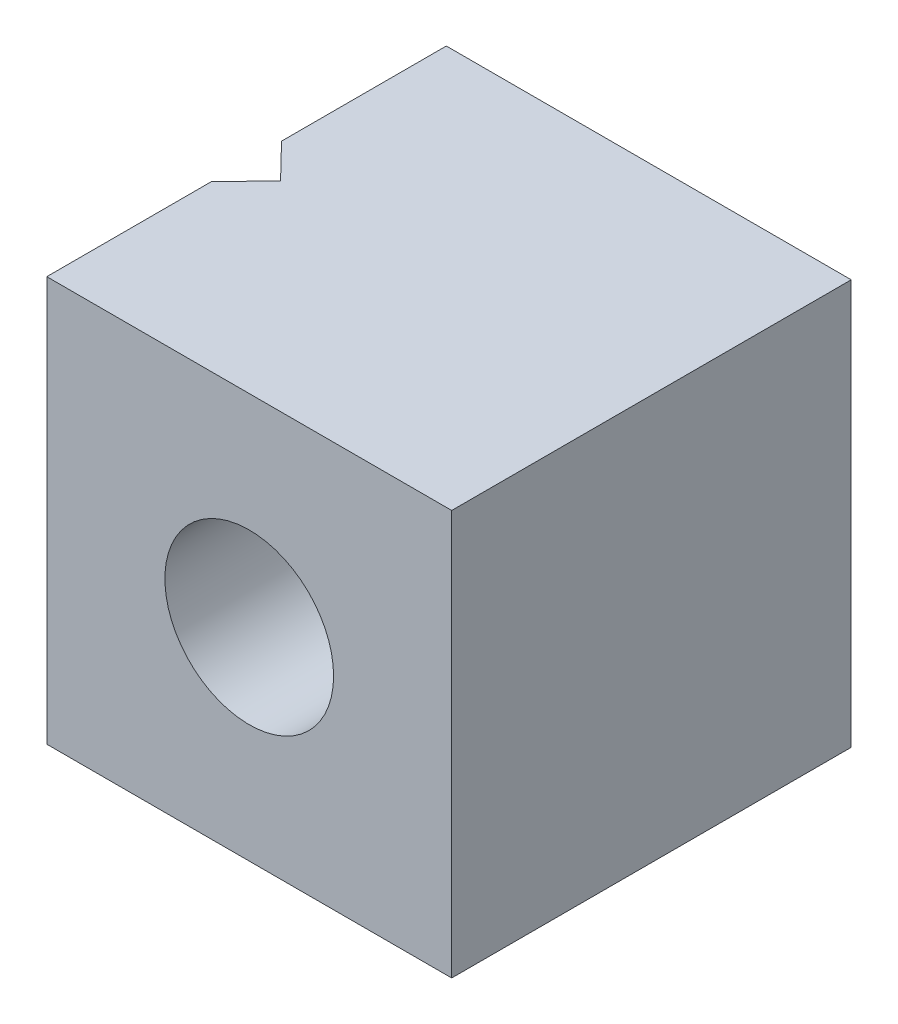
ISO-10303-21;
HEADER;
FILE_DESCRIPTION(('STEP AP214'),'2;1');
FILE_NAME('part.step','',(''),(''),'','','');
FILE_SCHEMA(('AUTOMOTIVE_DESIGN { 1 0 10303 214 1 1 1 1 }'));
ENDSEC;
DATA;
#1=APPLICATION_CONTEXT('core data for automotive mechanical design processes');
#2=APPLICATION_PROTOCOL_DEFINITION('international standard','automotive_design',2000,#1);
#3=PRODUCT_CONTEXT('',#1,'mechanical');
#4=PRODUCT('Part','Part','',(#3));
#5=PRODUCT_RELATED_PRODUCT_CATEGORY('part','',(#4));
#6=PRODUCT_DEFINITION_FORMATION('','',#4);
#7=PRODUCT_DEFINITION_CONTEXT('part definition',#1,'design');
#8=PRODUCT_DEFINITION('design','',#6,#7);
#9=PRODUCT_DEFINITION_SHAPE('','',#8);
#10=(LENGTH_UNIT() NAMED_UNIT(*) SI_UNIT(.MILLI.,.METRE.));
#11=(NAMED_UNIT(*) PLANE_ANGLE_UNIT() SI_UNIT($,.RADIAN.));
#12=(NAMED_UNIT(*) SI_UNIT($,.STERADIAN.) SOLID_ANGLE_UNIT());
#13=UNCERTAINTY_MEASURE_WITH_UNIT(LENGTH_MEASURE(1.E-05),#10,'distance_accuracy_value','');
#14=(GEOMETRIC_REPRESENTATION_CONTEXT(3) GLOBAL_UNCERTAINTY_ASSIGNED_CONTEXT((#13)) GLOBAL_UNIT_ASSIGNED_CONTEXT((#10,
#11,#12)) REPRESENTATION_CONTEXT('',''));
#15=CARTESIAN_POINT('',(0.,0.,0.));
#16=DIRECTION('',(0.,0.,1.));
#17=DIRECTION('',(1.,0.,0.));
#18=AXIS2_PLACEMENT_3D('',#15,#16,#17);
#19=CARTESIAN_POINT('',(0.,0.,-18.796));
#20=DIRECTION('',(-1.,0.,0.));
#21=DIRECTION('',(0.,0.,1.));
#22=AXIS2_PLACEMENT_3D('',#19,#20,#21);
#23=PLANE('',#22);
#24=DIRECTION('',(0.,1.,0.));
#25=VECTOR('',#24,1.);
#26=CARTESIAN_POINT('',(0.,-19.05,-11.0443839318378));
#27=LINE('',#26,#25);
#28=CARTESIAN_POINT('',(0.,-19.05,-11.0443839318378));
#29=VERTEX_POINT('',#28);
#30=CARTESIAN_POINT('',(0.,0.,-11.0443839318378));
#31=VERTEX_POINT('',#30);
#32=EDGE_CURVE('E161',#29,#31,#27,.T.);
#33=ORIENTED_EDGE('',*,*,#32,.T.);
#34=DIRECTION('',(0.,0.,1.));
#35=VECTOR('',#34,1.);
#36=CARTESIAN_POINT('',(0.,0.,-18.796));
#37=LINE('',#36,#35);
#38=CARTESIAN_POINT('',(0.,0.,-18.796));
#39=VERTEX_POINT('',#38);
#40=EDGE_CURVE('E11',#39,#31,#37,.T.);
#41=ORIENTED_EDGE('',*,*,#40,.F.);
#42=DIRECTION('',(0.,-1.,0.));
#43=VECTOR('',#42,1.);
#44=CARTESIAN_POINT('',(0.,0.,-18.796));
#45=LINE('',#44,#43);
#46=CARTESIAN_POINT('',(0.,-19.05,-18.796));
#47=VERTEX_POINT('',#46);
#48=EDGE_CURVE('E138',#39,#47,#45,.T.);
#49=ORIENTED_EDGE('',*,*,#48,.T.);
#50=DIRECTION('',(0.,0.,1.));
#51=VECTOR('',#50,1.);
#52=CARTESIAN_POINT('',(0.,-19.05,-18.796));
#53=LINE('',#52,#51);
#54=EDGE_CURVE('E37',#47,#29,#53,.T.);
#55=ORIENTED_EDGE('',*,*,#54,.T.);
#56=EDGE_LOOP('',(#33,#41,#49,#55));
#57=FACE_BOUND('',#56,.T.);
#58=ADVANCED_FACE('F33',(#57),#23,.T.);
#59=DIRECTION('',(0.,1.,0.));
#60=VECTOR('',#59,1.);
#61=CARTESIAN_POINT('',(0.,-19.05,-7.75161606816219));
#62=LINE('',#61,#60);
#63=CARTESIAN_POINT('',(0.,-19.05,-7.75161606816219));
#64=VERTEX_POINT('',#63);
#65=CARTESIAN_POINT('',(0.,0.,-7.75161606816219));
#66=VERTEX_POINT('',#65);
#67=EDGE_CURVE('E106',#64,#66,#62,.T.);
#68=ORIENTED_EDGE('',*,*,#67,.F.);
#69=CARTESIAN_POINT('',(0.,-19.05,0.));
#70=VERTEX_POINT('',#69);
#71=EDGE_CURVE('E111',#64,#70,#53,.T.);
#72=ORIENTED_EDGE('',*,*,#71,.T.);
#73=DIRECTION('',(0.,-1.,0.));
#74=VECTOR('',#73,1.);
#75=CARTESIAN_POINT('',(0.,0.,0.));
#76=LINE('',#75,#74);
#77=CARTESIAN_POINT('',(0.,0.,0.));
#78=VERTEX_POINT('',#77);
#79=EDGE_CURVE('E129',#78,#70,#76,.T.);
#80=ORIENTED_EDGE('',*,*,#79,.F.);
#81=EDGE_CURVE('E42',#66,#78,#37,.T.);
#82=ORIENTED_EDGE('',*,*,#81,.F.);
#83=EDGE_LOOP('',(#68,#72,#80,#82));
#84=FACE_BOUND('',#83,.T.);
#85=ADVANCED_FACE('F35',(#84),#23,.T.);
#86=CARTESIAN_POINT('',(0.,0.,-18.796));
#87=DIRECTION('',(0.,1.,0.));
#88=DIRECTION('',(0.,0.,1.));
#89=AXIS2_PLACEMENT_3D('',#86,#87,#88);
#90=PLANE('',#89);
#91=DIRECTION('',(-0.696977392207049,0.,-0.717093100477379));
#92=VECTOR('',#91,1.);
#93=CARTESIAN_POINT('',(-3.87423972045483,0.,-15.0304394398022));
#94=LINE('',#93,#92);
#95=CARTESIAN_POINT('',(1.6002,0.,-9.398));
#96=VERTEX_POINT('',#95);
#97=EDGE_CURVE('E156',#96,#31,#94,.T.);
#98=ORIENTED_EDGE('',*,*,#97,.F.);
#99=DIRECTION('',(0.696977392207049,0.,-0.71709310047738));
#100=VECTOR('',#99,1.);
#101=CARTESIAN_POINT('',(5.51995745666797,0.,-13.4308869474813));
#102=LINE('',#101,#100);
#103=EDGE_CURVE('E160',#66,#96,#102,.T.);
#104=ORIENTED_EDGE('',*,*,#103,.F.);
#105=ORIENTED_EDGE('',*,*,#81,.T.);
#106=DIRECTION('',(-1.,0.,0.));
#107=VECTOR('',#106,1.);
#108=CARTESIAN_POINT('',(0.,0.,0.));
#109=LINE('',#108,#107);
#110=CARTESIAN_POINT('',(19.05,0.,0.));
#111=VERTEX_POINT('',#110);
#112=EDGE_CURVE('E136',#111,#78,#109,.T.);
#113=ORIENTED_EDGE('',*,*,#112,.F.);
#114=DIRECTION('',(0.,0.,1.));
#115=VECTOR('',#114,1.);
#116=CARTESIAN_POINT('',(19.05,0.,-18.796));
#117=LINE('',#116,#115);
#118=CARTESIAN_POINT('',(19.05,0.,-18.796));
#119=VERTEX_POINT('',#118);
#120=EDGE_CURVE('E140',#119,#111,#117,.T.);
#121=ORIENTED_EDGE('',*,*,#120,.F.);
#122=DIRECTION('',(-1.,0.,0.));
#123=VECTOR('',#122,1.);
#124=CARTESIAN_POINT('',(0.,0.,-18.796));
#125=LINE('',#124,#123);
#126=EDGE_CURVE('E118',#119,#39,#125,.T.);
#127=ORIENTED_EDGE('',*,*,#126,.T.);
#128=ORIENTED_EDGE('',*,*,#40,.T.);
#129=EDGE_LOOP('',(#98,#104,#105,#113,#121,#127,#128));
#130=FACE_BOUND('',#129,.T.);
#131=ADVANCED_FACE('F148',(#130),#90,.T.);
#132=CARTESIAN_POINT('',(19.05,0.,-18.796));
#133=DIRECTION('',(1.,0.,0.));
#134=DIRECTION('',(0.,1.,0.));
#135=AXIS2_PLACEMENT_3D('',#132,#133,#134);
#136=PLANE('',#135);
#137=DIRECTION('',(0.,1.,0.));
#138=VECTOR('',#137,1.);
#139=CARTESIAN_POINT('',(19.05,0.,0.));
#140=LINE('',#139,#138);
#141=CARTESIAN_POINT('',(19.05,-19.05,0.));
#142=VERTEX_POINT('',#141);
#143=EDGE_CURVE('E133',#142,#111,#140,.T.);
#144=ORIENTED_EDGE('',*,*,#143,.F.);
#145=DIRECTION('',(0.,0.,1.));
#146=VECTOR('',#145,1.);
#147=CARTESIAN_POINT('',(19.05,-19.05,-18.796));
#148=LINE('',#147,#146);
#149=CARTESIAN_POINT('',(19.05,-19.05,-18.796));
#150=VERTEX_POINT('',#149);
#151=EDGE_CURVE('E119',#150,#142,#148,.T.);
#152=ORIENTED_EDGE('',*,*,#151,.F.);
#153=DIRECTION('',(0.,1.,0.));
#154=VECTOR('',#153,1.);
#155=CARTESIAN_POINT('',(19.05,0.,-18.796));
#156=LINE('',#155,#154);
#157=EDGE_CURVE('E121',#150,#119,#156,.T.);
#158=ORIENTED_EDGE('',*,*,#157,.T.);
#159=ORIENTED_EDGE('',*,*,#120,.T.);
#160=EDGE_LOOP('',(#144,#152,#158,#159));
#161=FACE_BOUND('',#160,.T.);
#162=ADVANCED_FACE('F144',(#161),#136,.T.);
#163=CARTESIAN_POINT('',(0.,-19.05,-18.796));
#164=DIRECTION('',(0.,-1.,0.));
#165=DIRECTION('',(0.,0.,-1.));
#166=AXIS2_PLACEMENT_3D('',#163,#164,#165);
#167=PLANE('',#166);
#168=DIRECTION('',(-0.696977392207049,0.,-0.717093100477379));
#169=VECTOR('',#168,1.);
#170=CARTESIAN_POINT('',(1.6002,-19.05,-9.398));
#171=LINE('',#170,#169);
#172=CARTESIAN_POINT('',(1.6002,-19.05,-9.398));
#173=VERTEX_POINT('',#172);
#174=EDGE_CURVE('E50',#173,#29,#171,.T.);
#175=ORIENTED_EDGE('',*,*,#174,.T.);
#176=ORIENTED_EDGE('',*,*,#54,.F.);
#177=DIRECTION('',(1.,0.,0.));
#178=VECTOR('',#177,1.);
#179=CARTESIAN_POINT('',(0.,-19.05,-18.796));
#180=LINE('',#179,#178);
#181=EDGE_CURVE('E125',#47,#150,#180,.T.);
#182=ORIENTED_EDGE('',*,*,#181,.T.);
#183=ORIENTED_EDGE('',*,*,#151,.T.);
#184=DIRECTION('',(1.,0.,0.));
#185=VECTOR('',#184,1.);
#186=CARTESIAN_POINT('',(0.,-19.05,0.));
#187=LINE('',#186,#185);
#188=EDGE_CURVE('E116',#70,#142,#187,.T.);
#189=ORIENTED_EDGE('',*,*,#188,.F.);
#190=ORIENTED_EDGE('',*,*,#71,.F.);
#191=DIRECTION('',(0.696977392207049,0.,-0.71709310047738));
#192=VECTOR('',#191,1.);
#193=CARTESIAN_POINT('',(0.,-19.05,-7.75161606816219));
#194=LINE('',#193,#192);
#195=EDGE_CURVE('E103',#64,#173,#194,.T.);
#196=ORIENTED_EDGE('',*,*,#195,.T.);
#197=EDGE_LOOP('',(#175,#176,#182,#183,#189,#190,#196));
#198=FACE_BOUND('',#197,.T.);
#199=ADVANCED_FACE('F114',(#198),#167,.T.);
#200=CARTESIAN_POINT('',(0.,0.,-18.796));
#201=DIRECTION('',(0.,0.,1.));
#202=DIRECTION('',(1.,0.,0.));
#203=AXIS2_PLACEMENT_3D('',#200,#201,#202);
#204=PLANE('',#203);
#205=CARTESIAN_POINT('',(9.525,-9.525,-18.796));
#206=DIRECTION('',(0.,0.,1.));
#207=DIRECTION('',(1.,0.,0.));
#208=AXIS2_PLACEMENT_3D('',#205,#206,#207);
#209=CIRCLE('',#208,3.96875);
#210=CARTESIAN_POINT('',(13.49375,-9.525,-18.796));
#211=VERTEX_POINT('',#210);
#212=EDGE_CURVE('E131',#211,#211,#209,.T.);
#213=ORIENTED_EDGE('',*,*,#212,.T.);
#214=EDGE_LOOP('',(#213));
#215=FACE_BOUND('',#214,.T.);
#216=ORIENTED_EDGE('',*,*,#48,.F.);
#217=ORIENTED_EDGE('',*,*,#126,.F.);
#218=ORIENTED_EDGE('',*,*,#157,.F.);
#219=ORIENTED_EDGE('',*,*,#181,.F.);
#220=EDGE_LOOP('',(#216,#217,#218,#219));
#221=FACE_BOUND('',#220,.T.);
#222=ADVANCED_FACE('F150',(#215,#221),#204,.F.);
#223=CARTESIAN_POINT('',(0.,0.,0.));
#224=DIRECTION('',(0.,0.,1.));
#225=DIRECTION('',(1.,0.,0.));
#226=AXIS2_PLACEMENT_3D('',#223,#224,#225);
#227=PLANE('',#226);
#228=CARTESIAN_POINT('',(9.525,-9.525,0.));
#229=DIRECTION('',(0.,0.,1.));
#230=DIRECTION('',(1.,0.,0.));
#231=AXIS2_PLACEMENT_3D('',#228,#229,#230);
#232=CIRCLE('',#231,3.96875);
#233=CARTESIAN_POINT('',(13.49375,-9.525,0.));
#234=VERTEX_POINT('',#233);
#235=EDGE_CURVE('E153',#234,#234,#232,.T.);
#236=ORIENTED_EDGE('',*,*,#235,.F.);
#237=EDGE_LOOP('',(#236));
#238=FACE_BOUND('',#237,.T.);
#239=ORIENTED_EDGE('',*,*,#79,.T.);
#240=ORIENTED_EDGE('',*,*,#188,.T.);
#241=ORIENTED_EDGE('',*,*,#143,.T.);
#242=ORIENTED_EDGE('',*,*,#112,.T.);
#243=EDGE_LOOP('',(#239,#240,#241,#242));
#244=FACE_BOUND('',#243,.T.);
#245=ADVANCED_FACE('F146',(#238,#244),#227,.T.);
#246=CARTESIAN_POINT('',(9.525,-9.525,-18.796));
#247=DIRECTION('',(0.,0.,1.));
#248=DIRECTION('',(1.,0.,0.));
#249=AXIS2_PLACEMENT_3D('',#246,#247,#248);
#250=CYLINDRICAL_SURFACE('',#249,3.96875);
#251=ORIENTED_EDGE('',*,*,#212,.F.);
#252=EDGE_LOOP('',(#251));
#253=FACE_BOUND('',#252,.T.);
#254=ORIENTED_EDGE('',*,*,#235,.T.);
#255=EDGE_LOOP('',(#254));
#256=FACE_BOUND('',#255,.T.);
#257=ADVANCED_FACE('F167',(#253,#256),#250,.F.);
#258=CARTESIAN_POINT('',(1.6002,-19.05,-9.398));
#259=DIRECTION('',(0.717093100477379,0.,-0.696977392207049));
#260=DIRECTION('',(-0.696977392207049,0.,-0.717093100477379));
#261=AXIS2_PLACEMENT_3D('',#258,#259,#260);
#262=PLANE('',#261);
#263=ORIENTED_EDGE('',*,*,#97,.T.);
#264=ORIENTED_EDGE('',*,*,#32,.F.);
#265=ORIENTED_EDGE('',*,*,#174,.F.);
#266=DIRECTION('',(0.,1.,0.));
#267=VECTOR('',#266,1.);
#268=CARTESIAN_POINT('',(1.6002,-19.05,-9.398));
#269=LINE('',#268,#267);
#270=EDGE_CURVE('E107',#173,#96,#269,.T.);
#271=ORIENTED_EDGE('',*,*,#270,.T.);
#272=EDGE_LOOP('',(#263,#264,#265,#271));
#273=FACE_BOUND('',#272,.T.);
#274=ADVANCED_FACE('F165',(#273),#262,.F.);
#275=CARTESIAN_POINT('',(0.,-19.05,-7.75161606816219));
#276=DIRECTION('',(0.71709310047738,0.,0.696977392207049));
#277=DIRECTION('',(0.696977392207049,0.,-0.71709310047738));
#278=AXIS2_PLACEMENT_3D('',#275,#276,#277);
#279=PLANE('',#278);
#280=ORIENTED_EDGE('',*,*,#103,.T.);
#281=ORIENTED_EDGE('',*,*,#270,.F.);
#282=ORIENTED_EDGE('',*,*,#195,.F.);
#283=ORIENTED_EDGE('',*,*,#67,.T.);
#284=EDGE_LOOP('',(#280,#281,#282,#283));
#285=FACE_BOUND('',#284,.T.);
#286=ADVANCED_FACE('F105',(#285),#279,.F.);
#287=CLOSED_SHELL('',(#58,#85,#131,#162,#199,#222,#245,#257,#274,#286));
#288=MANIFOLD_SOLID_BREP('B2',#287);
#289=ADVANCED_BREP_SHAPE_REPRESENTATION('',(#18,#288),#14);
#290=SHAPE_DEFINITION_REPRESENTATION(#9,#289);
ENDSEC;
END-ISO-10303-21;
